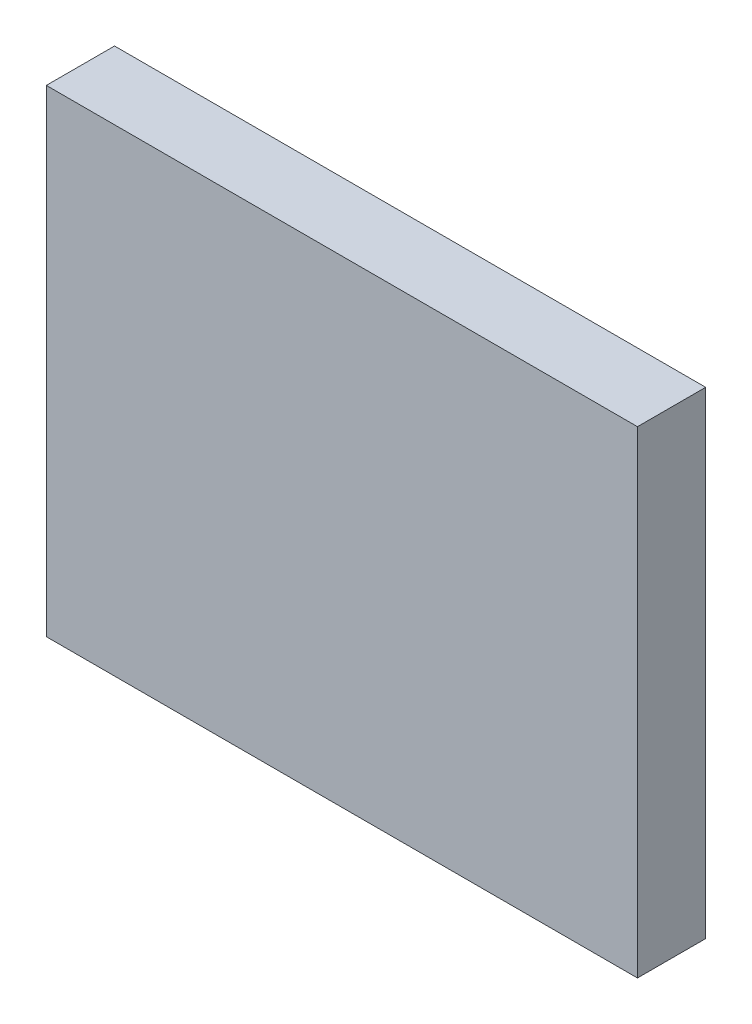
ISO-10303-21;
HEADER;
FILE_DESCRIPTION(('STEP AP214'),'2;1');
FILE_NAME('part.step','',(''),(''),'','','');
FILE_SCHEMA(('AUTOMOTIVE_DESIGN { 1 0 10303 214 1 1 1 1 }'));
ENDSEC;
DATA;
#1=APPLICATION_CONTEXT('core data for automotive mechanical design processes');
#2=APPLICATION_PROTOCOL_DEFINITION('international standard','automotive_design',2000,#1);
#3=PRODUCT_CONTEXT('',#1,'mechanical');
#4=PRODUCT('Part','Part','',(#3));
#5=PRODUCT_RELATED_PRODUCT_CATEGORY('part','',(#4));
#6=PRODUCT_DEFINITION_FORMATION('','',#4);
#7=PRODUCT_DEFINITION_CONTEXT('part definition',#1,'design');
#8=PRODUCT_DEFINITION('design','',#6,#7);
#9=PRODUCT_DEFINITION_SHAPE('','',#8);
#10=(LENGTH_UNIT() NAMED_UNIT(*) SI_UNIT(.MILLI.,.METRE.));
#11=(NAMED_UNIT(*) PLANE_ANGLE_UNIT() SI_UNIT($,.RADIAN.));
#12=(NAMED_UNIT(*) SI_UNIT($,.STERADIAN.) SOLID_ANGLE_UNIT());
#13=UNCERTAINTY_MEASURE_WITH_UNIT(LENGTH_MEASURE(1.E-05),#10,'distance_accuracy_value','');
#14=(GEOMETRIC_REPRESENTATION_CONTEXT(3) GLOBAL_UNCERTAINTY_ASSIGNED_CONTEXT((#13)) GLOBAL_UNIT_ASSIGNED_CONTEXT((#10,
#11,#12)) REPRESENTATION_CONTEXT('',''));
#15=CARTESIAN_POINT('',(0.,0.,0.));
#16=DIRECTION('',(0.,0.,1.));
#17=DIRECTION('',(1.,0.,0.));
#18=AXIS2_PLACEMENT_3D('',#15,#16,#17);
#19=CARTESIAN_POINT('',(13.,-10.5,3.));
#20=DIRECTION('',(-1.,0.,0.));
#21=DIRECTION('',(0.,0.,1.));
#22=AXIS2_PLACEMENT_3D('',#19,#20,#21);
#23=PLANE('',#22);
#24=DIRECTION('',(0.,1.,0.));
#25=VECTOR('',#24,1.);
#26=CARTESIAN_POINT('',(13.,-10.5,0.));
#27=LINE('',#26,#25);
#28=CARTESIAN_POINT('',(13.,-10.5,0.));
#29=VERTEX_POINT('',#28);
#30=CARTESIAN_POINT('',(13.,10.5,0.));
#31=VERTEX_POINT('',#30);
#32=EDGE_CURVE('E128',#29,#31,#27,.T.);
#33=ORIENTED_EDGE('',*,*,#32,.T.);
#34=DIRECTION('',(0.,0.,-1.));
#35=VECTOR('',#34,1.);
#36=CARTESIAN_POINT('',(13.,10.5,3.));
#37=LINE('',#36,#35);
#38=CARTESIAN_POINT('',(13.,10.5,3.));
#39=VERTEX_POINT('',#38);
#40=EDGE_CURVE('E12',#39,#31,#37,.T.);
#41=ORIENTED_EDGE('',*,*,#40,.F.);
#42=DIRECTION('',(0.,1.,0.));
#43=VECTOR('',#42,1.);
#44=CARTESIAN_POINT('',(13.,-10.5,3.));
#45=LINE('',#44,#43);
#46=CARTESIAN_POINT('',(13.,-10.5,3.));
#47=VERTEX_POINT('',#46);
#48=EDGE_CURVE('E92',#47,#39,#45,.T.);
#49=ORIENTED_EDGE('',*,*,#48,.F.);
#50=DIRECTION('',(0.,0.,-1.));
#51=VECTOR('',#50,1.);
#52=CARTESIAN_POINT('',(13.,-10.5,3.));
#53=LINE('',#52,#51);
#54=EDGE_CURVE('E104',#47,#29,#53,.T.);
#55=ORIENTED_EDGE('',*,*,#54,.T.);
#56=EDGE_LOOP('',(#33,#41,#49,#55));
#57=FACE_BOUND('',#56,.T.);
#58=ADVANCED_FACE('F40',(#57),#23,.F.);
#59=CARTESIAN_POINT('',(-13.,10.5,3.));
#60=DIRECTION('',(0.,-1.,0.));
#61=DIRECTION('',(0.,0.,-1.));
#62=AXIS2_PLACEMENT_3D('',#59,#60,#61);
#63=PLANE('',#62);
#64=DIRECTION('',(-1.,0.,0.));
#65=VECTOR('',#64,1.);
#66=CARTESIAN_POINT('',(-13.,10.5,0.));
#67=LINE('',#66,#65);
#68=CARTESIAN_POINT('',(-13.,10.5,0.));
#69=VERTEX_POINT('',#68);
#70=EDGE_CURVE('E97',#31,#69,#67,.T.);
#71=ORIENTED_EDGE('',*,*,#70,.T.);
#72=DIRECTION('',(0.,0.,-1.));
#73=VECTOR('',#72,1.);
#74=CARTESIAN_POINT('',(-13.,10.5,3.));
#75=LINE('',#74,#73);
#76=CARTESIAN_POINT('',(-13.,10.5,3.));
#77=VERTEX_POINT('',#76);
#78=EDGE_CURVE('E49',#77,#69,#75,.T.);
#79=ORIENTED_EDGE('',*,*,#78,.F.);
#80=DIRECTION('',(-1.,0.,0.));
#81=VECTOR('',#80,1.);
#82=CARTESIAN_POINT('',(-13.,10.5,3.));
#83=LINE('',#82,#81);
#84=EDGE_CURVE('E87',#39,#77,#83,.T.);
#85=ORIENTED_EDGE('',*,*,#84,.F.);
#86=ORIENTED_EDGE('',*,*,#40,.T.);
#87=EDGE_LOOP('',(#71,#79,#85,#86));
#88=FACE_BOUND('',#87,.T.);
#89=ADVANCED_FACE('F96',(#88),#63,.F.);
#90=CARTESIAN_POINT('',(-13.,-10.5,3.));
#91=DIRECTION('',(1.,0.,0.));
#92=DIRECTION('',(0.,0.,-1.));
#93=AXIS2_PLACEMENT_3D('',#90,#91,#92);
#94=PLANE('',#93);
#95=DIRECTION('',(0.,-1.,0.));
#96=VECTOR('',#95,1.);
#97=CARTESIAN_POINT('',(-13.,-10.5,0.));
#98=LINE('',#97,#96);
#99=CARTESIAN_POINT('',(-13.,-10.5,0.));
#100=VERTEX_POINT('',#99);
#101=EDGE_CURVE('E74',#69,#100,#98,.T.);
#102=ORIENTED_EDGE('',*,*,#101,.T.);
#103=DIRECTION('',(0.,0.,-1.));
#104=VECTOR('',#103,1.);
#105=CARTESIAN_POINT('',(-13.,-10.5,3.));
#106=LINE('',#105,#104);
#107=CARTESIAN_POINT('',(-13.,-10.5,3.));
#108=VERTEX_POINT('',#107);
#109=EDGE_CURVE('E99',#108,#100,#106,.T.);
#110=ORIENTED_EDGE('',*,*,#109,.F.);
#111=DIRECTION('',(0.,-1.,0.));
#112=VECTOR('',#111,1.);
#113=CARTESIAN_POINT('',(-13.,-10.5,3.));
#114=LINE('',#113,#112);
#115=EDGE_CURVE('E90',#77,#108,#114,.T.);
#116=ORIENTED_EDGE('',*,*,#115,.F.);
#117=ORIENTED_EDGE('',*,*,#78,.T.);
#118=EDGE_LOOP('',(#102,#110,#116,#117));
#119=FACE_BOUND('',#118,.T.);
#120=ADVANCED_FACE('F100',(#119),#94,.F.);
#121=CARTESIAN_POINT('',(-13.,-10.5,3.));
#122=DIRECTION('',(0.,1.,0.));
#123=DIRECTION('',(0.,0.,1.));
#124=AXIS2_PLACEMENT_3D('',#121,#122,#123);
#125=PLANE('',#124);
#126=DIRECTION('',(1.,0.,0.));
#127=VECTOR('',#126,1.);
#128=CARTESIAN_POINT('',(-13.,-10.5,0.));
#129=LINE('',#128,#127);
#130=EDGE_CURVE('E80',#100,#29,#129,.T.);
#131=ORIENTED_EDGE('',*,*,#130,.T.);
#132=ORIENTED_EDGE('',*,*,#54,.F.);
#133=DIRECTION('',(1.,0.,0.));
#134=VECTOR('',#133,1.);
#135=CARTESIAN_POINT('',(-13.,-10.5,3.));
#136=LINE('',#135,#134);
#137=EDGE_CURVE('E57',#108,#47,#136,.T.);
#138=ORIENTED_EDGE('',*,*,#137,.F.);
#139=ORIENTED_EDGE('',*,*,#109,.T.);
#140=EDGE_LOOP('',(#131,#132,#138,#139));
#141=FACE_BOUND('',#140,.T.);
#142=ADVANCED_FACE('F123',(#141),#125,.F.);
#143=CARTESIAN_POINT('',(0.,0.,3.));
#144=DIRECTION('',(0.,0.,-1.));
#145=DIRECTION('',(-1.,0.,0.));
#146=AXIS2_PLACEMENT_3D('',#143,#144,#145);
#147=PLANE('',#146);
#148=ORIENTED_EDGE('',*,*,#48,.T.);
#149=ORIENTED_EDGE('',*,*,#84,.T.);
#150=ORIENTED_EDGE('',*,*,#115,.T.);
#151=ORIENTED_EDGE('',*,*,#137,.T.);
#152=EDGE_LOOP('',(#148,#149,#150,#151));
#153=FACE_BOUND('',#152,.T.);
#154=ADVANCED_FACE('F88',(#153),#147,.F.);
#155=CARTESIAN_POINT('',(0.,0.,0.));
#156=DIRECTION('',(0.,0.,-1.));
#157=DIRECTION('',(-1.,0.,0.));
#158=AXIS2_PLACEMENT_3D('',#155,#156,#157);
#159=PLANE('',#158);
#160=ORIENTED_EDGE('',*,*,#32,.F.);
#161=ORIENTED_EDGE('',*,*,#130,.F.);
#162=ORIENTED_EDGE('',*,*,#101,.F.);
#163=ORIENTED_EDGE('',*,*,#70,.F.);
#164=EDGE_LOOP('',(#160,#161,#162,#163));
#165=FACE_BOUND('',#164,.T.);
#166=ADVANCED_FACE('F126',(#165),#159,.T.);
#167=CLOSED_SHELL('',(#58,#89,#120,#142,#154,#166));
#168=MANIFOLD_SOLID_BREP('B2',#167);
#169=ADVANCED_BREP_SHAPE_REPRESENTATION('',(#18,#168),#14);
#170=SHAPE_DEFINITION_REPRESENTATION(#9,#169);
ENDSEC;
END-ISO-10303-21;
